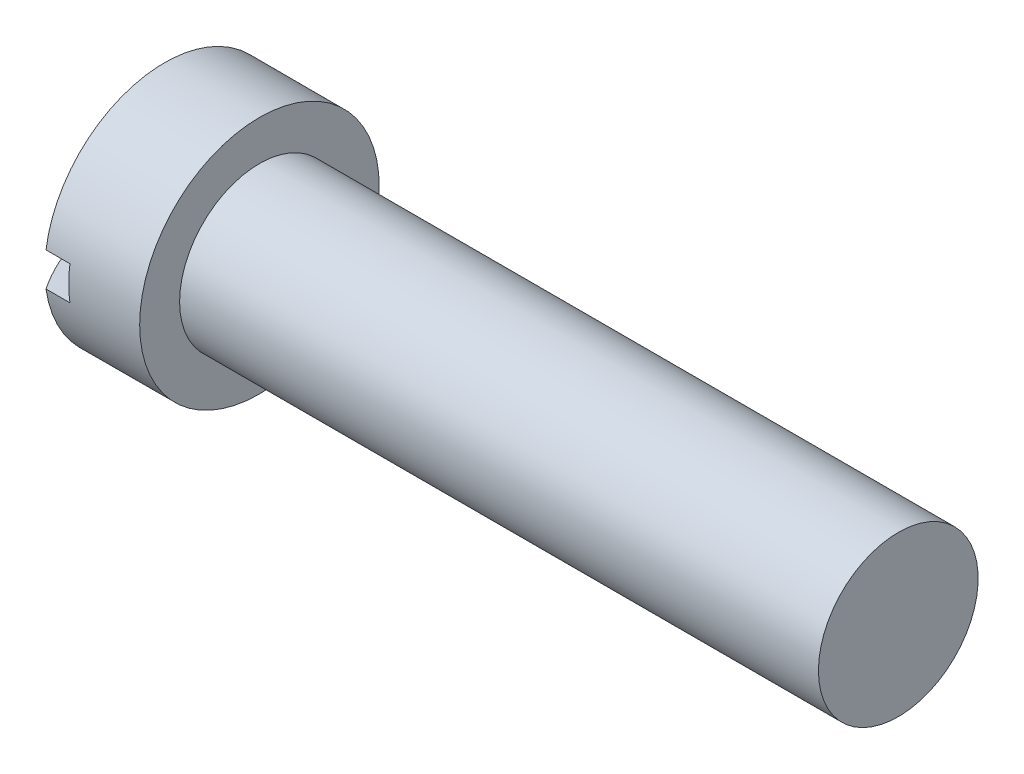
ISO-10303-21;
HEADER;
FILE_DESCRIPTION(('STEP AP214'),'2;1');
FILE_NAME('part.step','',(''),(''),'','','');
FILE_SCHEMA(('AUTOMOTIVE_DESIGN { 1 0 10303 214 1 1 1 1 }'));
ENDSEC;
DATA;
#1=APPLICATION_CONTEXT('core data for automotive mechanical design processes');
#2=APPLICATION_PROTOCOL_DEFINITION('international standard','automotive_design',2000,#1);
#3=PRODUCT_CONTEXT('',#1,'mechanical');
#4=PRODUCT('Part','Part','',(#3));
#5=PRODUCT_RELATED_PRODUCT_CATEGORY('part','',(#4));
#6=PRODUCT_DEFINITION_FORMATION('','',#4);
#7=PRODUCT_DEFINITION_CONTEXT('part definition',#1,'design');
#8=PRODUCT_DEFINITION('design','',#6,#7);
#9=PRODUCT_DEFINITION_SHAPE('','',#8);
#10=(LENGTH_UNIT() NAMED_UNIT(*) SI_UNIT(.MILLI.,.METRE.));
#11=(NAMED_UNIT(*) PLANE_ANGLE_UNIT() SI_UNIT($,.RADIAN.));
#12=(NAMED_UNIT(*) SI_UNIT($,.STERADIAN.) SOLID_ANGLE_UNIT());
#13=UNCERTAINTY_MEASURE_WITH_UNIT(LENGTH_MEASURE(1.E-05),#10,'distance_accuracy_value','');
#14=(GEOMETRIC_REPRESENTATION_CONTEXT(3) GLOBAL_UNCERTAINTY_ASSIGNED_CONTEXT((#13)) GLOBAL_UNIT_ASSIGNED_CONTEXT((#10,
#11,#12)) REPRESENTATION_CONTEXT('',''));
#15=CARTESIAN_POINT('',(0.,0.,0.));
#16=DIRECTION('',(0.,0.,1.));
#17=DIRECTION('',(1.,0.,0.));
#18=AXIS2_PLACEMENT_3D('',#15,#16,#17);
#19=CARTESIAN_POINT('',(16.9903913043479,0.,0.));
#20=DIRECTION('',(-1.,0.,0.));
#21=DIRECTION('',(0.,1.,0.));
#22=AXIS2_PLACEMENT_3D('',#19,#20,#21);
#23=SPHERICAL_SURFACE('',#22,16.9903913043479);
#24=CARTESIAN_POINT('',(2.921,0.,0.));
#25=DIRECTION('',(-1.,0.,0.));
#26=DIRECTION('',(0.,0.,1.));
#27=AXIS2_PLACEMENT_3D('',#24,#25,#26);
#28=CIRCLE('',#27,9.525);
#29=CARTESIAN_POINT('',(2.921,-1.3462,-9.42938866311067));
#30=VERTEX_POINT('',#29);
#31=CARTESIAN_POINT('',(2.921,-1.3462,9.42938866311067));
#32=VERTEX_POINT('',#31);
#33=EDGE_CURVE('E86',#30,#32,#28,.T.);
#34=ORIENTED_EDGE('',*,*,#33,.T.);
#35=CARTESIAN_POINT('',(16.9903913043479,-1.3462,0.));
#36=DIRECTION('',(0.,1.,0.));
#37=DIRECTION('',(0.,0.,1.));
#38=AXIS2_PLACEMENT_3D('',#35,#36,#37);
#39=CIRCLE('',#38,16.9369755929109);
#40=EDGE_CURVE('E110',#32,#30,#39,.F.);
#41=ORIENTED_EDGE('',*,*,#40,.T.);
#42=EDGE_LOOP('',(#34,#41));
#43=FACE_BOUND('',#42,.T.);
#44=ADVANCED_FACE('F32',(#43),#23,.T.);
#45=CARTESIAN_POINT('',(2.921,1.3462,9.42938866311067));
#46=VERTEX_POINT('',#45);
#47=CARTESIAN_POINT('',(2.921,1.3462,-9.42938866311067));
#48=VERTEX_POINT('',#47);
#49=EDGE_CURVE('E88',#46,#48,#28,.T.);
#50=ORIENTED_EDGE('',*,*,#49,.T.);
#51=CARTESIAN_POINT('',(16.9903913043479,1.3462,0.));
#52=DIRECTION('',(0.,-1.,0.));
#53=DIRECTION('',(0.,0.,-1.));
#54=AXIS2_PLACEMENT_3D('',#51,#52,#53);
#55=CIRCLE('',#54,16.9369755929109);
#56=EDGE_CURVE('E106',#48,#46,#55,.F.);
#57=ORIENTED_EDGE('',*,*,#56,.T.);
#58=EDGE_LOOP('',(#50,#57));
#59=FACE_BOUND('',#58,.T.);
#60=ADVANCED_FACE('F109',(#59),#23,.T.);
#61=CARTESIAN_POINT('',(-25.4,0.,0.));
#62=DIRECTION('',(-1.,0.,0.));
#63=DIRECTION('',(0.,0.,1.));
#64=AXIS2_PLACEMENT_3D('',#61,#62,#63);
#65=CYLINDRICAL_SURFACE('',#64,9.525);
#66=CARTESIAN_POINT('',(10.4648,0.,0.));
#67=DIRECTION('',(-1.,0.,0.));
#68=DIRECTION('',(0.,0.,1.));
#69=AXIS2_PLACEMENT_3D('',#66,#67,#68);
#70=CIRCLE('',#69,9.525);
#71=CARTESIAN_POINT('',(10.4648,0.,9.525));
#72=VERTEX_POINT('',#71);
#73=EDGE_CURVE('E89',#72,#72,#70,.T.);
#74=ORIENTED_EDGE('',*,*,#73,.T.);
#75=EDGE_LOOP('',(#74));
#76=FACE_BOUND('',#75,.T.);
#77=DIRECTION('',(-1.,0.,0.));
#78=VECTOR('',#77,1.);
#79=CARTESIAN_POINT('',(-25.4,-1.3462,-9.42938866311067));
#80=LINE('',#79,#78);
#81=CARTESIAN_POINT('',(4.826,-1.3462,-9.42938866311067));
#82=VERTEX_POINT('',#81);
#83=EDGE_CURVE('E11',#82,#30,#80,.T.);
#84=ORIENTED_EDGE('',*,*,#83,.F.);
#85=CARTESIAN_POINT('',(4.826,0.,0.));
#86=DIRECTION('',(-1.,0.,0.));
#87=DIRECTION('',(0.,0.,1.));
#88=AXIS2_PLACEMENT_3D('',#85,#86,#87);
#89=CIRCLE('',#88,9.525);
#90=CARTESIAN_POINT('',(4.826,1.3462,-9.42938866311067));
#91=VERTEX_POINT('',#90);
#92=EDGE_CURVE('E69',#91,#82,#89,.T.);
#93=ORIENTED_EDGE('',*,*,#92,.F.);
#94=DIRECTION('',(-1.,0.,0.));
#95=VECTOR('',#94,1.);
#96=CARTESIAN_POINT('',(-25.4,1.3462,-9.42938866311067));
#97=LINE('',#96,#95);
#98=EDGE_CURVE('E40',#48,#91,#97,.F.);
#99=ORIENTED_EDGE('',*,*,#98,.F.);
#100=ORIENTED_EDGE('',*,*,#49,.F.);
#101=DIRECTION('',(-1.,0.,0.));
#102=VECTOR('',#101,1.);
#103=CARTESIAN_POINT('',(-25.4,1.3462,9.42938866311067));
#104=LINE('',#103,#102);
#105=CARTESIAN_POINT('',(4.826,1.3462,9.42938866311067));
#106=VERTEX_POINT('',#105);
#107=EDGE_CURVE('E100',#106,#46,#104,.T.);
#108=ORIENTED_EDGE('',*,*,#107,.F.);
#109=CARTESIAN_POINT('',(4.826,-1.3462,9.42938866311067));
#110=VERTEX_POINT('',#109);
#111=EDGE_CURVE('E78',#110,#106,#89,.T.);
#112=ORIENTED_EDGE('',*,*,#111,.F.);
#113=DIRECTION('',(-1.,0.,0.));
#114=VECTOR('',#113,1.);
#115=CARTESIAN_POINT('',(-25.4,-1.3462,9.42938866311067));
#116=LINE('',#115,#114);
#117=EDGE_CURVE('E76',#32,#110,#116,.F.);
#118=ORIENTED_EDGE('',*,*,#117,.F.);
#119=ORIENTED_EDGE('',*,*,#33,.F.);
#120=EDGE_LOOP('',(#84,#93,#99,#100,#108,#112,#118,#119));
#121=FACE_BOUND('',#120,.T.);
#122=ADVANCED_FACE('F84',(#76,#121),#65,.T.);
#123=CARTESIAN_POINT('',(-25.4,0.,0.));
#124=DIRECTION('',(-1.,0.,0.));
#125=DIRECTION('',(0.,0.,1.));
#126=AXIS2_PLACEMENT_3D('',#123,#124,#125);
#127=CYLINDRICAL_SURFACE('',#126,6.35);
#128=CARTESIAN_POINT('',(61.2648,0.,0.));
#129=DIRECTION('',(-1.,0.,0.));
#130=DIRECTION('',(0.,0.,1.));
#131=AXIS2_PLACEMENT_3D('',#128,#129,#130);
#132=CIRCLE('',#131,6.35);
#133=CARTESIAN_POINT('',(61.2648,0.,6.35));
#134=VERTEX_POINT('',#133);
#135=EDGE_CURVE('E92',#134,#134,#132,.T.);
#136=ORIENTED_EDGE('',*,*,#135,.T.);
#137=EDGE_LOOP('',(#136));
#138=FACE_BOUND('',#137,.T.);
#139=CARTESIAN_POINT('',(10.4648,0.,0.));
#140=DIRECTION('',(-1.,0.,0.));
#141=DIRECTION('',(0.,0.,1.));
#142=AXIS2_PLACEMENT_3D('',#139,#140,#141);
#143=CIRCLE('',#142,6.35);
#144=CARTESIAN_POINT('',(10.4648,0.,6.35));
#145=VERTEX_POINT('',#144);
#146=EDGE_CURVE('E94',#145,#145,#143,.T.);
#147=ORIENTED_EDGE('',*,*,#146,.F.);
#148=EDGE_LOOP('',(#147));
#149=FACE_BOUND('',#148,.T.);
#150=ADVANCED_FACE('F34',(#138,#149),#127,.T.);
#151=CARTESIAN_POINT('',(61.2648,6.35,0.));
#152=DIRECTION('',(1.,0.,0.));
#153=DIRECTION('',(0.,0.,-1.));
#154=AXIS2_PLACEMENT_3D('',#151,#152,#153);
#155=PLANE('',#154);
#156=ORIENTED_EDGE('',*,*,#135,.F.);
#157=EDGE_LOOP('',(#156));
#158=FACE_BOUND('',#157,.T.);
#159=ADVANCED_FACE('F120',(#158),#155,.T.);
#160=CARTESIAN_POINT('',(10.4648,6.35,0.));
#161=DIRECTION('',(-1.,0.,0.));
#162=DIRECTION('',(0.,0.,1.));
#163=AXIS2_PLACEMENT_3D('',#160,#161,#162);
#164=PLANE('',#163);
#165=ORIENTED_EDGE('',*,*,#73,.F.);
#166=EDGE_LOOP('',(#165));
#167=FACE_BOUND('',#166,.T.);
#168=ORIENTED_EDGE('',*,*,#146,.T.);
#169=EDGE_LOOP('',(#168));
#170=FACE_BOUND('',#169,.T.);
#171=ADVANCED_FACE('F117',(#167,#170),#164,.F.);
#172=CARTESIAN_POINT('',(4.826,-1.3462,-9.525));
#173=DIRECTION('',(0.,1.,0.));
#174=DIRECTION('',(0.,0.,1.));
#175=AXIS2_PLACEMENT_3D('',#172,#173,#174);
#176=PLANE('',#175);
#177=ORIENTED_EDGE('',*,*,#83,.T.);
#178=ORIENTED_EDGE('',*,*,#40,.F.);
#179=ORIENTED_EDGE('',*,*,#117,.T.);
#180=DIRECTION('',(0.,0.,-1.));
#181=VECTOR('',#180,1.);
#182=CARTESIAN_POINT('',(4.826,-1.3462,-9.525));
#183=LINE('',#182,#181);
#184=EDGE_CURVE('E47',#110,#82,#183,.T.);
#185=ORIENTED_EDGE('',*,*,#184,.T.);
#186=EDGE_LOOP('',(#177,#178,#179,#185));
#187=FACE_BOUND('',#186,.T.);
#188=ADVANCED_FACE('F79',(#187),#176,.T.);
#189=CARTESIAN_POINT('',(4.826,1.3462,9.525));
#190=DIRECTION('',(0.,-1.,0.));
#191=DIRECTION('',(0.,0.,-1.));
#192=AXIS2_PLACEMENT_3D('',#189,#190,#191);
#193=PLANE('',#192);
#194=ORIENTED_EDGE('',*,*,#107,.T.);
#195=ORIENTED_EDGE('',*,*,#56,.F.);
#196=ORIENTED_EDGE('',*,*,#98,.T.);
#197=DIRECTION('',(0.,0.,1.));
#198=VECTOR('',#197,1.);
#199=CARTESIAN_POINT('',(4.826,1.3462,9.525));
#200=LINE('',#199,#198);
#201=EDGE_CURVE('E72',#91,#106,#200,.T.);
#202=ORIENTED_EDGE('',*,*,#201,.T.);
#203=EDGE_LOOP('',(#194,#195,#196,#202));
#204=FACE_BOUND('',#203,.T.);
#205=ADVANCED_FACE('F103',(#204),#193,.T.);
#206=CARTESIAN_POINT('',(4.826,-1.3462,9.525));
#207=DIRECTION('',(-1.,0.,0.));
#208=DIRECTION('',(0.,0.,1.));
#209=AXIS2_PLACEMENT_3D('',#206,#207,#208);
#210=PLANE('',#209);
#211=ORIENTED_EDGE('',*,*,#201,.F.);
#212=ORIENTED_EDGE('',*,*,#92,.T.);
#213=ORIENTED_EDGE('',*,*,#184,.F.);
#214=ORIENTED_EDGE('',*,*,#111,.T.);
#215=EDGE_LOOP('',(#211,#212,#213,#214));
#216=FACE_BOUND('',#215,.T.);
#217=ADVANCED_FACE('F70',(#216),#210,.T.);
#218=CLOSED_SHELL('',(#44,#60,#122,#150,#159,#171,#188,#205,#217));
#219=MANIFOLD_SOLID_BREP('B2',#218);
#220=ADVANCED_BREP_SHAPE_REPRESENTATION('',(#18,#219),#14);
#221=SHAPE_DEFINITION_REPRESENTATION(#9,#220);
ENDSEC;
END-ISO-10303-21;
